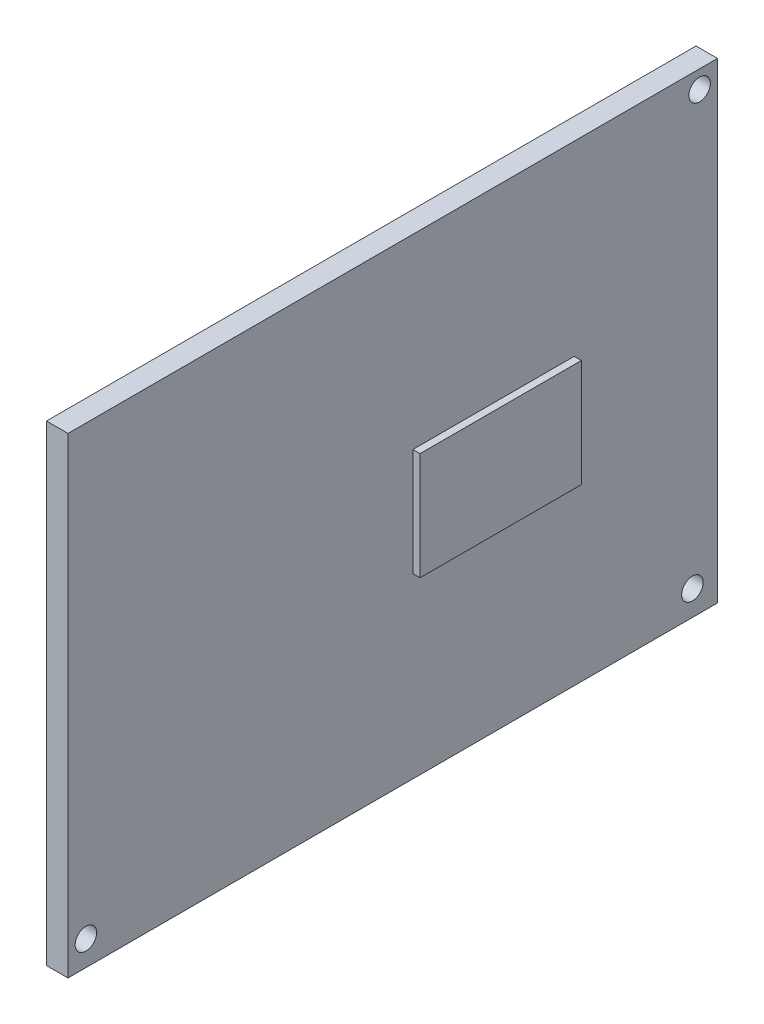
ISO-10303-21;
HEADER;
FILE_DESCRIPTION(('STEP AP214'),'2;1');
FILE_NAME('part.step','',(''),(''),'','','');
FILE_SCHEMA(('AUTOMOTIVE_DESIGN { 1 0 10303 214 1 1 1 1 }'));
ENDSEC;
DATA;
#1=APPLICATION_CONTEXT('core data for automotive mechanical design processes');
#2=APPLICATION_PROTOCOL_DEFINITION('international standard','automotive_design',2000,#1);
#3=PRODUCT_CONTEXT('',#1,'mechanical');
#4=PRODUCT('Part','Part','',(#3));
#5=PRODUCT_RELATED_PRODUCT_CATEGORY('part','',(#4));
#6=PRODUCT_DEFINITION_FORMATION('','',#4);
#7=PRODUCT_DEFINITION_CONTEXT('part definition',#1,'design');
#8=PRODUCT_DEFINITION('design','',#6,#7);
#9=PRODUCT_DEFINITION_SHAPE('','',#8);
#10=(LENGTH_UNIT() NAMED_UNIT(*) SI_UNIT(.MILLI.,.METRE.));
#11=(NAMED_UNIT(*) PLANE_ANGLE_UNIT() SI_UNIT($,.RADIAN.));
#12=(NAMED_UNIT(*) SI_UNIT($,.STERADIAN.) SOLID_ANGLE_UNIT());
#13=UNCERTAINTY_MEASURE_WITH_UNIT(LENGTH_MEASURE(1.E-05),#10,'distance_accuracy_value','');
#14=(GEOMETRIC_REPRESENTATION_CONTEXT(3) GLOBAL_UNCERTAINTY_ASSIGNED_CONTEXT((#13)) GLOBAL_UNIT_ASSIGNED_CONTEXT((#10,
#11,#12)) REPRESENTATION_CONTEXT('',''));
#15=CARTESIAN_POINT('',(0.,0.,0.));
#16=DIRECTION('',(0.,0.,1.));
#17=DIRECTION('',(1.,0.,0.));
#18=AXIS2_PLACEMENT_3D('',#15,#16,#17);
#19=CARTESIAN_POINT('',(3.,0.,0.));
#20=DIRECTION('',(-1.,0.,0.));
#21=DIRECTION('',(0.,0.,1.));
#22=AXIS2_PLACEMENT_3D('',#19,#20,#21);
#23=PLANE('',#22);
#24=CARTESIAN_POINT('',(3.,3.5,-2.5));
#25=DIRECTION('',(1.,0.,0.));
#26=DIRECTION('',(0.,0.,-1.));
#27=AXIS2_PLACEMENT_3D('',#24,#25,#26);
#28=CIRCLE('',#27,1.5);
#29=CARTESIAN_POINT('',(3.,3.5,-4.));
#30=VERTEX_POINT('',#29);
#31=EDGE_CURVE('E125',#30,#30,#28,.T.);
#32=ORIENTED_EDGE('',*,*,#31,.F.);
#33=EDGE_LOOP('',(#32));
#34=FACE_BOUND('',#33,.T.);
#35=CARTESIAN_POINT('',(3.,3.5,-87.12));
#36=DIRECTION('',(1.,0.,0.));
#37=DIRECTION('',(0.,0.,-1.));
#38=AXIS2_PLACEMENT_3D('',#35,#36,#37);
#39=CIRCLE('',#38,1.5);
#40=CARTESIAN_POINT('',(3.,3.5,-88.62));
#41=VERTEX_POINT('',#40);
#42=EDGE_CURVE('E134',#41,#41,#39,.T.);
#43=ORIENTED_EDGE('',*,*,#42,.F.);
#44=EDGE_LOOP('',(#43));
#45=FACE_BOUND('',#44,.T.);
#46=CARTESIAN_POINT('',(3.,63.3,-88.12));
#47=DIRECTION('',(1.,0.,0.));
#48=DIRECTION('',(0.,0.,-1.));
#49=AXIS2_PLACEMENT_3D('',#46,#47,#48);
#50=CIRCLE('',#49,1.5);
#51=CARTESIAN_POINT('',(3.,63.3,-89.62));
#52=VERTEX_POINT('',#51);
#53=EDGE_CURVE('E140',#52,#52,#50,.T.);
#54=ORIENTED_EDGE('',*,*,#53,.F.);
#55=EDGE_LOOP('',(#54));
#56=FACE_BOUND('',#55,.T.);
#57=DIRECTION('',(0.,-1.,0.));
#58=VECTOR('',#57,1.);
#59=CARTESIAN_POINT('',(3.,0.,0.));
#60=LINE('',#59,#58);
#61=CARTESIAN_POINT('',(3.,65.8,0.));
#62=VERTEX_POINT('',#61);
#63=CARTESIAN_POINT('',(3.,0.,0.));
#64=VERTEX_POINT('',#63);
#65=EDGE_CURVE('E146',#62,#64,#60,.T.);
#66=ORIENTED_EDGE('',*,*,#65,.T.);
#67=DIRECTION('',(0.,0.,-1.));
#68=VECTOR('',#67,1.);
#69=CARTESIAN_POINT('',(3.,0.,0.));
#70=LINE('',#69,#68);
#71=CARTESIAN_POINT('',(3.,0.,-90.62));
#72=VERTEX_POINT('',#71);
#73=EDGE_CURVE('E149',#64,#72,#70,.T.);
#74=ORIENTED_EDGE('',*,*,#73,.T.);
#75=DIRECTION('',(0.,1.,0.));
#76=VECTOR('',#75,1.);
#77=CARTESIAN_POINT('',(3.,0.,-90.62));
#78=LINE('',#77,#76);
#79=CARTESIAN_POINT('',(3.,65.8,-90.62));
#80=VERTEX_POINT('',#79);
#81=EDGE_CURVE('E152',#72,#80,#78,.T.);
#82=ORIENTED_EDGE('',*,*,#81,.T.);
#83=DIRECTION('',(0.,0.,1.));
#84=VECTOR('',#83,1.);
#85=CARTESIAN_POINT('',(3.,65.8,0.));
#86=LINE('',#85,#84);
#87=EDGE_CURVE('E154',#80,#62,#86,.T.);
#88=ORIENTED_EDGE('',*,*,#87,.T.);
#89=EDGE_LOOP('',(#66,#74,#82,#88));
#90=FACE_BOUND('',#89,.T.);
#91=DIRECTION('',(0.,-1.,0.));
#92=VECTOR('',#91,1.);
#93=CARTESIAN_POINT('',(3.,39.8,-48.12));
#94=LINE('',#93,#92);
#95=CARTESIAN_POINT('',(3.,39.8,-48.12));
#96=VERTEX_POINT('',#95);
#97=CARTESIAN_POINT('',(3.,24.8,-48.12));
#98=VERTEX_POINT('',#97);
#99=EDGE_CURVE('E52',#96,#98,#94,.T.);
#100=ORIENTED_EDGE('',*,*,#99,.F.);
#101=DIRECTION('',(0.,0.,1.));
#102=VECTOR('',#101,1.);
#103=CARTESIAN_POINT('',(3.,39.8,-48.12));
#104=LINE('',#103,#102);
#105=CARTESIAN_POINT('',(3.,39.8,-70.62));
#106=VERTEX_POINT('',#105);
#107=EDGE_CURVE('E56',#106,#96,#104,.T.);
#108=ORIENTED_EDGE('',*,*,#107,.F.);
#109=DIRECTION('',(0.,1.,0.));
#110=VECTOR('',#109,1.);
#111=CARTESIAN_POINT('',(3.,39.8,-70.62));
#112=LINE('',#111,#110);
#113=CARTESIAN_POINT('',(3.,24.8,-70.62));
#114=VERTEX_POINT('',#113);
#115=EDGE_CURVE('E323',#114,#106,#112,.T.);
#116=ORIENTED_EDGE('',*,*,#115,.F.);
#117=DIRECTION('',(0.,0.,-1.));
#118=VECTOR('',#117,1.);
#119=CARTESIAN_POINT('',(3.,24.8,-48.12));
#120=LINE('',#119,#118);
#121=EDGE_CURVE('E329',#98,#114,#120,.T.);
#122=ORIENTED_EDGE('',*,*,#121,.F.);
#123=EDGE_LOOP('',(#100,#108,#116,#122));
#124=FACE_BOUND('',#123,.T.);
#125=ADVANCED_FACE('F37',(#34,#45,#56,#90,#124),#23,.F.);
#126=CARTESIAN_POINT('',(0.,0.,0.));
#127=DIRECTION('',(-1.,0.,0.));
#128=DIRECTION('',(0.,0.,1.));
#129=AXIS2_PLACEMENT_3D('',#126,#127,#128);
#130=PLANE('',#129);
#131=CARTESIAN_POINT('',(0.,3.5,-87.12));
#132=DIRECTION('',(1.,0.,0.));
#133=DIRECTION('',(0.,0.,-1.));
#134=AXIS2_PLACEMENT_3D('',#131,#132,#133);
#135=CIRCLE('',#134,1.5);
#136=CARTESIAN_POINT('',(0.,3.5,-88.62));
#137=VERTEX_POINT('',#136);
#138=EDGE_CURVE('E132',#137,#137,#135,.T.);
#139=ORIENTED_EDGE('',*,*,#138,.T.);
#140=EDGE_LOOP('',(#139));
#141=FACE_BOUND('',#140,.T.);
#142=DIRECTION('',(0.,-1.,0.));
#143=VECTOR('',#142,1.);
#144=CARTESIAN_POINT('',(0.,0.,0.));
#145=LINE('',#144,#143);
#146=CARTESIAN_POINT('',(0.,65.8,0.));
#147=VERTEX_POINT('',#146);
#148=CARTESIAN_POINT('',(0.,0.,0.));
#149=VERTEX_POINT('',#148);
#150=EDGE_CURVE('E143',#147,#149,#145,.T.);
#151=ORIENTED_EDGE('',*,*,#150,.F.);
#152=DIRECTION('',(0.,0.,1.));
#153=VECTOR('',#152,1.);
#154=CARTESIAN_POINT('',(0.,65.8,0.));
#155=LINE('',#154,#153);
#156=CARTESIAN_POINT('',(0.,65.8,-90.62));
#157=VERTEX_POINT('',#156);
#158=EDGE_CURVE('E150',#157,#147,#155,.T.);
#159=ORIENTED_EDGE('',*,*,#158,.F.);
#160=DIRECTION('',(0.,1.,0.));
#161=VECTOR('',#160,1.);
#162=CARTESIAN_POINT('',(0.,0.,-90.62));
#163=LINE('',#162,#161);
#164=CARTESIAN_POINT('',(0.,0.,-90.62));
#165=VERTEX_POINT('',#164);
#166=EDGE_CURVE('E161',#165,#157,#163,.T.);
#167=ORIENTED_EDGE('',*,*,#166,.F.);
#168=DIRECTION('',(0.,0.,-1.));
#169=VECTOR('',#168,1.);
#170=CARTESIAN_POINT('',(0.,0.,0.));
#171=LINE('',#170,#169);
#172=EDGE_CURVE('E159',#149,#165,#171,.T.);
#173=ORIENTED_EDGE('',*,*,#172,.F.);
#174=EDGE_LOOP('',(#151,#159,#167,#173));
#175=FACE_BOUND('',#174,.T.);
#176=CARTESIAN_POINT('',(0.,63.3,-88.12));
#177=DIRECTION('',(1.,0.,0.));
#178=DIRECTION('',(0.,0.,-1.));
#179=AXIS2_PLACEMENT_3D('',#176,#177,#178);
#180=CIRCLE('',#179,1.5);
#181=CARTESIAN_POINT('',(0.,63.3,-89.62));
#182=VERTEX_POINT('',#181);
#183=EDGE_CURVE('E137',#182,#182,#180,.T.);
#184=ORIENTED_EDGE('',*,*,#183,.T.);
#185=EDGE_LOOP('',(#184));
#186=FACE_BOUND('',#185,.T.);
#187=CARTESIAN_POINT('',(0.,3.5,-2.5));
#188=DIRECTION('',(1.,0.,0.));
#189=DIRECTION('',(0.,0.,-1.));
#190=AXIS2_PLACEMENT_3D('',#187,#188,#189);
#191=CIRCLE('',#190,1.5);
#192=CARTESIAN_POINT('',(0.,3.5,-4.));
#193=VERTEX_POINT('',#192);
#194=EDGE_CURVE('E122',#193,#193,#191,.T.);
#195=ORIENTED_EDGE('',*,*,#194,.T.);
#196=EDGE_LOOP('',(#195));
#197=FACE_BOUND('',#196,.T.);
#198=ADVANCED_FACE('F179',(#141,#175,#186,#197),#130,.T.);
#199=CARTESIAN_POINT('',(3.,0.,0.));
#200=DIRECTION('',(0.,0.,-1.));
#201=DIRECTION('',(0.,1.,0.));
#202=AXIS2_PLACEMENT_3D('',#199,#200,#201);
#203=PLANE('',#202);
#204=ORIENTED_EDGE('',*,*,#150,.T.);
#205=DIRECTION('',(-1.,0.,0.));
#206=VECTOR('',#205,1.);
#207=CARTESIAN_POINT('',(3.,0.,0.));
#208=LINE('',#207,#206);
#209=EDGE_CURVE('E11',#64,#149,#208,.T.);
#210=ORIENTED_EDGE('',*,*,#209,.F.);
#211=ORIENTED_EDGE('',*,*,#65,.F.);
#212=DIRECTION('',(-1.,0.,0.));
#213=VECTOR('',#212,1.);
#214=CARTESIAN_POINT('',(3.,65.8,0.));
#215=LINE('',#214,#213);
#216=EDGE_CURVE('E156',#62,#147,#215,.T.);
#217=ORIENTED_EDGE('',*,*,#216,.T.);
#218=EDGE_LOOP('',(#204,#210,#211,#217));
#219=FACE_BOUND('',#218,.T.);
#220=ADVANCED_FACE('F39',(#219),#203,.F.);
#221=CARTESIAN_POINT('',(3.,0.,0.));
#222=DIRECTION('',(0.,1.,0.));
#223=DIRECTION('',(0.,0.,1.));
#224=AXIS2_PLACEMENT_3D('',#221,#222,#223);
#225=PLANE('',#224);
#226=ORIENTED_EDGE('',*,*,#172,.T.);
#227=DIRECTION('',(-1.,0.,0.));
#228=VECTOR('',#227,1.);
#229=CARTESIAN_POINT('',(3.,0.,-90.62));
#230=LINE('',#229,#228);
#231=EDGE_CURVE('E45',#72,#165,#230,.T.);
#232=ORIENTED_EDGE('',*,*,#231,.F.);
#233=ORIENTED_EDGE('',*,*,#73,.F.);
#234=ORIENTED_EDGE('',*,*,#209,.T.);
#235=EDGE_LOOP('',(#226,#232,#233,#234));
#236=FACE_BOUND('',#235,.T.);
#237=ADVANCED_FACE('F189',(#236),#225,.F.);
#238=CARTESIAN_POINT('',(3.,0.,-90.62));
#239=DIRECTION('',(0.,0.,1.));
#240=DIRECTION('',(0.,-1.,0.));
#241=AXIS2_PLACEMENT_3D('',#238,#239,#240);
#242=PLANE('',#241);
#243=ORIENTED_EDGE('',*,*,#166,.T.);
#244=DIRECTION('',(-1.,0.,0.));
#245=VECTOR('',#244,1.);
#246=CARTESIAN_POINT('',(3.,65.8,-90.62));
#247=LINE('',#246,#245);
#248=EDGE_CURVE('E166',#80,#157,#247,.T.);
#249=ORIENTED_EDGE('',*,*,#248,.F.);
#250=ORIENTED_EDGE('',*,*,#81,.F.);
#251=ORIENTED_EDGE('',*,*,#231,.T.);
#252=EDGE_LOOP('',(#243,#249,#250,#251));
#253=FACE_BOUND('',#252,.T.);
#254=ADVANCED_FACE('F173',(#253),#242,.F.);
#255=CARTESIAN_POINT('',(3.,65.8,0.));
#256=DIRECTION('',(0.,-1.,0.));
#257=DIRECTION('',(0.,0.,-1.));
#258=AXIS2_PLACEMENT_3D('',#255,#256,#257);
#259=PLANE('',#258);
#260=ORIENTED_EDGE('',*,*,#158,.T.);
#261=ORIENTED_EDGE('',*,*,#216,.F.);
#262=ORIENTED_EDGE('',*,*,#87,.F.);
#263=ORIENTED_EDGE('',*,*,#248,.T.);
#264=EDGE_LOOP('',(#260,#261,#262,#263));
#265=FACE_BOUND('',#264,.T.);
#266=ADVANCED_FACE('F183',(#265),#259,.F.);
#267=CARTESIAN_POINT('',(3.,63.3,-88.12));
#268=DIRECTION('',(-1.,0.,0.));
#269=DIRECTION('',(0.,0.,1.));
#270=AXIS2_PLACEMENT_3D('',#267,#268,#269);
#271=CYLINDRICAL_SURFACE('',#270,1.5);
#272=ORIENTED_EDGE('',*,*,#53,.T.);
#273=EDGE_LOOP('',(#272));
#274=FACE_BOUND('',#273,.T.);
#275=ORIENTED_EDGE('',*,*,#183,.F.);
#276=EDGE_LOOP('',(#275));
#277=FACE_BOUND('',#276,.T.);
#278=ADVANCED_FACE('F207',(#274,#277),#271,.F.);
#279=CARTESIAN_POINT('',(3.,3.5,-87.12));
#280=DIRECTION('',(-1.,0.,0.));
#281=DIRECTION('',(0.,0.,1.));
#282=AXIS2_PLACEMENT_3D('',#279,#280,#281);
#283=CYLINDRICAL_SURFACE('',#282,1.5);
#284=ORIENTED_EDGE('',*,*,#42,.T.);
#285=EDGE_LOOP('',(#284));
#286=FACE_BOUND('',#285,.T.);
#287=ORIENTED_EDGE('',*,*,#138,.F.);
#288=EDGE_LOOP('',(#287));
#289=FACE_BOUND('',#288,.T.);
#290=ADVANCED_FACE('F214',(#286,#289),#283,.F.);
#291=CARTESIAN_POINT('',(3.,3.5,-2.5));
#292=DIRECTION('',(-1.,0.,0.));
#293=DIRECTION('',(0.,0.,1.));
#294=AXIS2_PLACEMENT_3D('',#291,#292,#293);
#295=CYLINDRICAL_SURFACE('',#294,1.5);
#296=ORIENTED_EDGE('',*,*,#31,.T.);
#297=EDGE_LOOP('',(#296));
#298=FACE_BOUND('',#297,.T.);
#299=ORIENTED_EDGE('',*,*,#194,.F.);
#300=EDGE_LOOP('',(#299));
#301=FACE_BOUND('',#300,.T.);
#302=ADVANCED_FACE('F219',(#298,#301),#295,.F.);
#303=CARTESIAN_POINT('',(4.,39.8,-48.12));
#304=DIRECTION('',(0.,0.,-1.));
#305=DIRECTION('',(0.,1.,0.));
#306=AXIS2_PLACEMENT_3D('',#303,#304,#305);
#307=PLANE('',#306);
#308=ORIENTED_EDGE('',*,*,#99,.T.);
#309=DIRECTION('',(-1.,0.,0.));
#310=VECTOR('',#309,1.);
#311=CARTESIAN_POINT('',(4.,24.8,-48.12));
#312=LINE('',#311,#310);
#313=CARTESIAN_POINT('',(4.,24.8,-48.12));
#314=VERTEX_POINT('',#313);
#315=EDGE_CURVE('E105',#314,#98,#312,.T.);
#316=ORIENTED_EDGE('',*,*,#315,.F.);
#317=DIRECTION('',(0.,-1.,0.));
#318=VECTOR('',#317,1.);
#319=CARTESIAN_POINT('',(4.,39.8,-48.12));
#320=LINE('',#319,#318);
#321=CARTESIAN_POINT('',(4.,39.8,-48.12));
#322=VERTEX_POINT('',#321);
#323=EDGE_CURVE('E111',#322,#314,#320,.T.);
#324=ORIENTED_EDGE('',*,*,#323,.F.);
#325=DIRECTION('',(-1.,0.,0.));
#326=VECTOR('',#325,1.);
#327=CARTESIAN_POINT('',(4.,39.8,-48.12));
#328=LINE('',#327,#326);
#329=EDGE_CURVE('E321',#322,#96,#328,.T.);
#330=ORIENTED_EDGE('',*,*,#329,.T.);
#331=EDGE_LOOP('',(#308,#316,#324,#330));
#332=FACE_BOUND('',#331,.T.);
#333=ADVANCED_FACE('F121',(#332),#307,.F.);
#334=CARTESIAN_POINT('',(4.,24.8,-48.12));
#335=DIRECTION('',(0.,1.,0.));
#336=DIRECTION('',(0.,0.,1.));
#337=AXIS2_PLACEMENT_3D('',#334,#335,#336);
#338=PLANE('',#337);
#339=ORIENTED_EDGE('',*,*,#121,.T.);
#340=DIRECTION('',(-1.,0.,0.));
#341=VECTOR('',#340,1.);
#342=CARTESIAN_POINT('',(4.,24.8,-70.62));
#343=LINE('',#342,#341);
#344=CARTESIAN_POINT('',(4.,24.8,-70.62));
#345=VERTEX_POINT('',#344);
#346=EDGE_CURVE('E107',#345,#114,#343,.T.);
#347=ORIENTED_EDGE('',*,*,#346,.F.);
#348=DIRECTION('',(0.,0.,-1.));
#349=VECTOR('',#348,1.);
#350=CARTESIAN_POINT('',(4.,24.8,-48.12));
#351=LINE('',#350,#349);
#352=EDGE_CURVE('E100',#314,#345,#351,.T.);
#353=ORIENTED_EDGE('',*,*,#352,.F.);
#354=ORIENTED_EDGE('',*,*,#315,.T.);
#355=EDGE_LOOP('',(#339,#347,#353,#354));
#356=FACE_BOUND('',#355,.T.);
#357=ADVANCED_FACE('F103',(#356),#338,.F.);
#358=CARTESIAN_POINT('',(4.,39.8,-70.62));
#359=DIRECTION('',(0.,0.,1.));
#360=DIRECTION('',(1.,0.,0.));
#361=AXIS2_PLACEMENT_3D('',#358,#359,#360);
#362=PLANE('',#361);
#363=ORIENTED_EDGE('',*,*,#115,.T.);
#364=DIRECTION('',(-1.,0.,0.));
#365=VECTOR('',#364,1.);
#366=CARTESIAN_POINT('',(4.,39.8,-70.62));
#367=LINE('',#366,#365);
#368=CARTESIAN_POINT('',(4.,39.8,-70.62));
#369=VERTEX_POINT('',#368);
#370=EDGE_CURVE('E127',#369,#106,#367,.T.);
#371=ORIENTED_EDGE('',*,*,#370,.F.);
#372=DIRECTION('',(0.,1.,0.));
#373=VECTOR('',#372,1.);
#374=CARTESIAN_POINT('',(4.,39.8,-70.62));
#375=LINE('',#374,#373);
#376=EDGE_CURVE('E110',#345,#369,#375,.T.);
#377=ORIENTED_EDGE('',*,*,#376,.F.);
#378=ORIENTED_EDGE('',*,*,#346,.T.);
#379=EDGE_LOOP('',(#363,#371,#377,#378));
#380=FACE_BOUND('',#379,.T.);
#381=ADVANCED_FACE('F237',(#380),#362,.F.);
#382=CARTESIAN_POINT('',(4.,39.8,-48.12));
#383=DIRECTION('',(0.,-1.,0.));
#384=DIRECTION('',(0.,0.,-1.));
#385=AXIS2_PLACEMENT_3D('',#382,#383,#384);
#386=PLANE('',#385);
#387=ORIENTED_EDGE('',*,*,#107,.T.);
#388=ORIENTED_EDGE('',*,*,#329,.F.);
#389=DIRECTION('',(0.,0.,1.));
#390=VECTOR('',#389,1.);
#391=CARTESIAN_POINT('',(4.,39.8,-48.12));
#392=LINE('',#391,#390);
#393=EDGE_CURVE('E116',#369,#322,#392,.T.);
#394=ORIENTED_EDGE('',*,*,#393,.F.);
#395=ORIENTED_EDGE('',*,*,#370,.T.);
#396=EDGE_LOOP('',(#387,#388,#394,#395));
#397=FACE_BOUND('',#396,.T.);
#398=ADVANCED_FACE('F240',(#397),#386,.F.);
#399=CARTESIAN_POINT('',(4.,0.,0.));
#400=DIRECTION('',(1.,0.,0.));
#401=DIRECTION('',(0.,0.,-1.));
#402=AXIS2_PLACEMENT_3D('',#399,#400,#401);
#403=PLANE('',#402);
#404=ORIENTED_EDGE('',*,*,#323,.T.);
#405=ORIENTED_EDGE('',*,*,#352,.T.);
#406=ORIENTED_EDGE('',*,*,#376,.T.);
#407=ORIENTED_EDGE('',*,*,#393,.T.);
#408=EDGE_LOOP('',(#404,#405,#406,#407));
#409=FACE_BOUND('',#408,.T.);
#410=ADVANCED_FACE('F114',(#409),#403,.T.);
#411=CLOSED_SHELL('',(#125,#198,#220,#237,#254,#266,#278,#290,#302,#333,#357,#381,#398,#410));
#412=MANIFOLD_SOLID_BREP('B2',#411);
#413=ADVANCED_BREP_SHAPE_REPRESENTATION('',(#18,#412),#14);
#414=SHAPE_DEFINITION_REPRESENTATION(#9,#413);
ENDSEC;
END-ISO-10303-21;
